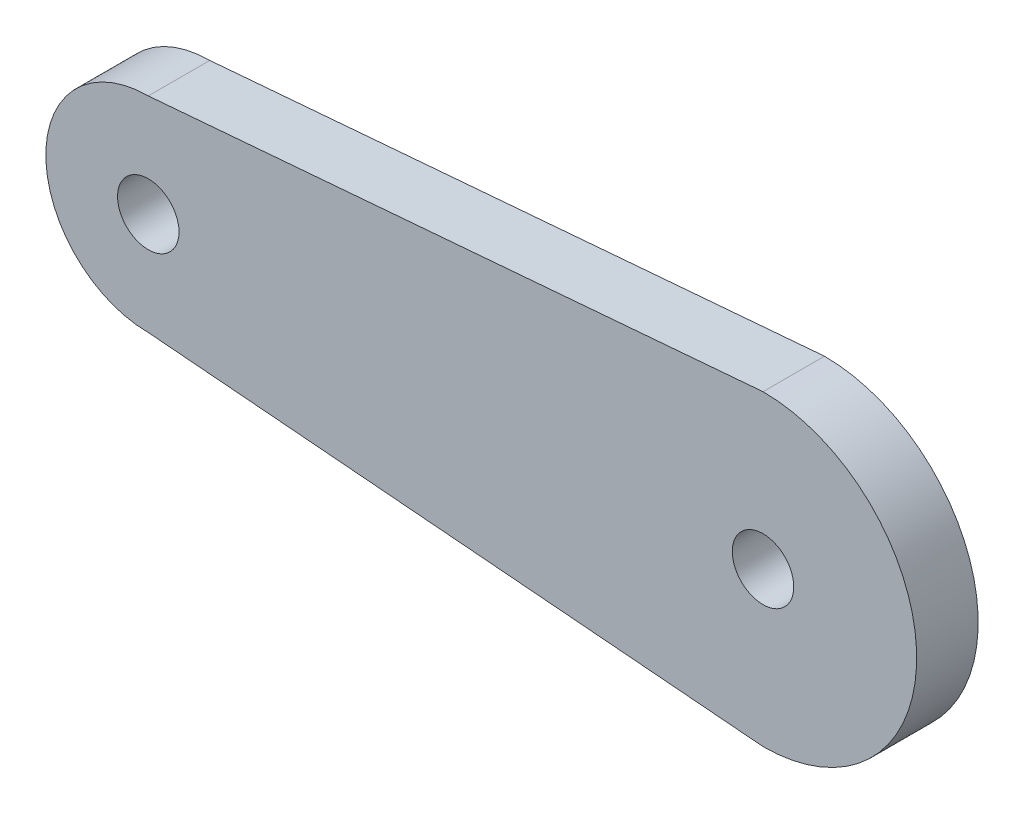
ISO-10303-21;
HEADER;
FILE_DESCRIPTION(('STEP AP214'),'2;1');
FILE_NAME('part.step','',(''),(''),'','','');
FILE_SCHEMA(('AUTOMOTIVE_DESIGN { 1 0 10303 214 1 1 1 1 }'));
ENDSEC;
DATA;
#1=APPLICATION_CONTEXT('core data for automotive mechanical design processes');
#2=APPLICATION_PROTOCOL_DEFINITION('international standard','automotive_design',2000,#1);
#3=PRODUCT_CONTEXT('',#1,'mechanical');
#4=PRODUCT('Part','Part','',(#3));
#5=PRODUCT_RELATED_PRODUCT_CATEGORY('part','',(#4));
#6=PRODUCT_DEFINITION_FORMATION('','',#4);
#7=PRODUCT_DEFINITION_CONTEXT('part definition',#1,'design');
#8=PRODUCT_DEFINITION('design','',#6,#7);
#9=PRODUCT_DEFINITION_SHAPE('','',#8);
#10=(LENGTH_UNIT() NAMED_UNIT(*) SI_UNIT(.MILLI.,.METRE.));
#11=(NAMED_UNIT(*) PLANE_ANGLE_UNIT() SI_UNIT($,.RADIAN.));
#12=(NAMED_UNIT(*) SI_UNIT($,.STERADIAN.) SOLID_ANGLE_UNIT());
#13=UNCERTAINTY_MEASURE_WITH_UNIT(LENGTH_MEASURE(1.E-05),#10,'distance_accuracy_value','');
#14=(GEOMETRIC_REPRESENTATION_CONTEXT(3) GLOBAL_UNCERTAINTY_ASSIGNED_CONTEXT((#13)) GLOBAL_UNIT_ASSIGNED_CONTEXT((#10,
#11,#12)) REPRESENTATION_CONTEXT('',''));
#15=CARTESIAN_POINT('',(0.,0.,0.));
#16=DIRECTION('',(0.,0.,1.));
#17=DIRECTION('',(1.,0.,0.));
#18=AXIS2_PLACEMENT_3D('',#15,#16,#17);
#19=CARTESIAN_POINT('',(30.,0.,3.));
#20=DIRECTION('',(0.,0.,-1.));
#21=DIRECTION('',(-1.,0.,0.));
#22=AXIS2_PLACEMENT_3D('',#19,#20,#21);
#23=CYLINDRICAL_SURFACE('',#22,7.5);
#24=CARTESIAN_POINT('',(30.,0.,0.));
#25=DIRECTION('',(0.,0.,1.));
#26=DIRECTION('',(1.,0.,0.));
#27=AXIS2_PLACEMENT_3D('',#24,#25,#26);
#28=CIRCLE('',#27,7.5);
#29=CARTESIAN_POINT('',(30.,7.50000000000001,0.));
#30=VERTEX_POINT('',#29);
#31=CARTESIAN_POINT('',(30.,-7.49999999999999,0.));
#32=VERTEX_POINT('',#31);
#33=EDGE_CURVE('E109',#30,#32,#28,.F.);
#34=ORIENTED_EDGE('',*,*,#33,.F.);
#35=DIRECTION('',(0.,0.,-1.));
#36=VECTOR('',#35,1.);
#37=CARTESIAN_POINT('',(30.,7.50000000000001,3.));
#38=LINE('',#37,#36);
#39=CARTESIAN_POINT('',(30.,7.50000000000001,3.));
#40=VERTEX_POINT('',#39);
#41=EDGE_CURVE('E11',#40,#30,#38,.T.);
#42=ORIENTED_EDGE('',*,*,#41,.F.);
#43=CARTESIAN_POINT('',(30.,0.,3.));
#44=DIRECTION('',(0.,0.,1.));
#45=DIRECTION('',(1.,0.,0.));
#46=AXIS2_PLACEMENT_3D('',#43,#44,#45);
#47=CIRCLE('',#46,7.5);
#48=CARTESIAN_POINT('',(30.,-7.49999999999999,3.));
#49=VERTEX_POINT('',#48);
#50=EDGE_CURVE('E97',#40,#49,#47,.F.);
#51=ORIENTED_EDGE('',*,*,#50,.T.);
#52=DIRECTION('',(0.,0.,-1.));
#53=VECTOR('',#52,1.);
#54=CARTESIAN_POINT('',(30.,-7.49999999999999,3.));
#55=LINE('',#54,#53);
#56=EDGE_CURVE('E77',#49,#32,#55,.T.);
#57=ORIENTED_EDGE('',*,*,#56,.T.);
#58=EDGE_LOOP('',(#34,#42,#51,#57));
#59=FACE_BOUND('',#58,.T.);
#60=ADVANCED_FACE('F39',(#59),#23,.T.);
#61=CARTESIAN_POINT('',(-0.413793103448277,4.96551724137931,3.));
#62=DIRECTION('',(-0.0830454798537402,0.996545758244879,0.));
#63=DIRECTION('',(-0.99654575824488,-0.0830454798537402,0.));
#64=AXIS2_PLACEMENT_3D('',#61,#62,#63);
#65=PLANE('',#64);
#66=DIRECTION('',(0.99654575824488,0.0830454798537402,0.));
#67=VECTOR('',#66,1.);
#68=CARTESIAN_POINT('',(-0.413793103448277,4.96551724137931,0.));
#69=LINE('',#68,#67);
#70=CARTESIAN_POINT('',(0.,5.,0.));
#71=VERTEX_POINT('',#70);
#72=EDGE_CURVE('E90',#71,#30,#69,.T.);
#73=ORIENTED_EDGE('',*,*,#72,.F.);
#74=DIRECTION('',(0.,0.,-1.));
#75=VECTOR('',#74,1.);
#76=CARTESIAN_POINT('',(0.,5.,3.));
#77=LINE('',#76,#75);
#78=CARTESIAN_POINT('',(0.,5.,3.));
#79=VERTEX_POINT('',#78);
#80=EDGE_CURVE('E47',#79,#71,#77,.T.);
#81=ORIENTED_EDGE('',*,*,#80,.F.);
#82=DIRECTION('',(0.99654575824488,0.0830454798537402,0.));
#83=VECTOR('',#82,1.);
#84=CARTESIAN_POINT('',(-0.413793103448277,4.96551724137931,3.));
#85=LINE('',#84,#83);
#86=EDGE_CURVE('E88',#79,#40,#85,.T.);
#87=ORIENTED_EDGE('',*,*,#86,.T.);
#88=ORIENTED_EDGE('',*,*,#41,.T.);
#89=EDGE_LOOP('',(#73,#81,#87,#88));
#90=FACE_BOUND('',#89,.T.);
#91=ADVANCED_FACE('F86',(#90),#65,.T.);
#92=CARTESIAN_POINT('',(0.,0.,3.));
#93=DIRECTION('',(0.,0.,-1.));
#94=DIRECTION('',(-1.,0.,0.));
#95=AXIS2_PLACEMENT_3D('',#92,#93,#94);
#96=CYLINDRICAL_SURFACE('',#95,5.);
#97=CARTESIAN_POINT('',(0.,0.,0.));
#98=DIRECTION('',(0.,0.,1.));
#99=DIRECTION('',(1.,0.,0.));
#100=AXIS2_PLACEMENT_3D('',#97,#98,#99);
#101=CIRCLE('',#100,5.);
#102=CARTESIAN_POINT('',(0.,-5.,0.));
#103=VERTEX_POINT('',#102);
#104=EDGE_CURVE('E70',#71,#103,#101,.T.);
#105=ORIENTED_EDGE('',*,*,#104,.T.);
#106=DIRECTION('',(0.,0.,-1.));
#107=VECTOR('',#106,1.);
#108=CARTESIAN_POINT('',(0.,-5.,3.));
#109=LINE('',#108,#107);
#110=CARTESIAN_POINT('',(0.,-5.,3.));
#111=VERTEX_POINT('',#110);
#112=EDGE_CURVE('E91',#111,#103,#109,.T.);
#113=ORIENTED_EDGE('',*,*,#112,.F.);
#114=CARTESIAN_POINT('',(0.,0.,3.));
#115=DIRECTION('',(0.,0.,1.));
#116=DIRECTION('',(1.,0.,0.));
#117=AXIS2_PLACEMENT_3D('',#114,#115,#116);
#118=CIRCLE('',#117,5.);
#119=EDGE_CURVE('E92',#79,#111,#118,.T.);
#120=ORIENTED_EDGE('',*,*,#119,.F.);
#121=ORIENTED_EDGE('',*,*,#80,.T.);
#122=EDGE_LOOP('',(#105,#113,#120,#121));
#123=FACE_BOUND('',#122,.T.);
#124=ADVANCED_FACE('F93',(#123),#96,.T.);
#125=CARTESIAN_POINT('',(30.,0.,3.));
#126=DIRECTION('',(0.,0.,-1.));
#127=DIRECTION('',(-1.,0.,0.));
#128=AXIS2_PLACEMENT_3D('',#125,#126,#127);
#129=CYLINDRICAL_SURFACE('',#128,1.5);
#130=CARTESIAN_POINT('',(30.,0.,3.));
#131=DIRECTION('',(0.,0.,1.));
#132=DIRECTION('',(1.,0.,0.));
#133=AXIS2_PLACEMENT_3D('',#130,#131,#132);
#134=CIRCLE('',#133,1.5);
#135=CARTESIAN_POINT('',(31.5,0.,3.));
#136=VERTEX_POINT('',#135);
#137=EDGE_CURVE('E103',#136,#136,#134,.T.);
#138=ORIENTED_EDGE('',*,*,#137,.T.);
#139=EDGE_LOOP('',(#138));
#140=FACE_BOUND('',#139,.T.);
#141=CARTESIAN_POINT('',(30.,0.,0.));
#142=DIRECTION('',(0.,0.,1.));
#143=DIRECTION('',(1.,0.,0.));
#144=AXIS2_PLACEMENT_3D('',#141,#142,#143);
#145=CIRCLE('',#144,1.5);
#146=CARTESIAN_POINT('',(31.5,0.,0.));
#147=VERTEX_POINT('',#146);
#148=EDGE_CURVE('E116',#147,#147,#145,.T.);
#149=ORIENTED_EDGE('',*,*,#148,.F.);
#150=EDGE_LOOP('',(#149));
#151=FACE_BOUND('',#150,.T.);
#152=ADVANCED_FACE('F135',(#140,#151),#129,.F.);
#153=CARTESIAN_POINT('',(-0.413793103448274,-4.96551724137931,3.));
#154=DIRECTION('',(0.0830454798537395,0.99654575824488,0.));
#155=DIRECTION('',(-0.99654575824488,0.0830454798537396,0.));
#156=AXIS2_PLACEMENT_3D('',#153,#154,#155);
#157=PLANE('',#156);
#158=DIRECTION('',(0.99654575824488,-0.0830454798537396,0.));
#159=VECTOR('',#158,1.);
#160=CARTESIAN_POINT('',(-0.413793103448274,-4.96551724137931,0.));
#161=LINE('',#160,#159);
#162=EDGE_CURVE('E114',#103,#32,#161,.T.);
#163=ORIENTED_EDGE('',*,*,#162,.T.);
#164=ORIENTED_EDGE('',*,*,#56,.F.);
#165=DIRECTION('',(0.99654575824488,-0.0830454798537396,0.));
#166=VECTOR('',#165,1.);
#167=CARTESIAN_POINT('',(-0.413793103448274,-4.96551724137931,3.));
#168=LINE('',#167,#166);
#169=EDGE_CURVE('E55',#111,#49,#168,.T.);
#170=ORIENTED_EDGE('',*,*,#169,.F.);
#171=ORIENTED_EDGE('',*,*,#112,.T.);
#172=EDGE_LOOP('',(#163,#164,#170,#171));
#173=FACE_BOUND('',#172,.T.);
#174=ADVANCED_FACE('F124',(#173),#157,.F.);
#175=CARTESIAN_POINT('',(0.,0.,3.));
#176=DIRECTION('',(0.,0.,-1.));
#177=DIRECTION('',(-1.,0.,0.));
#178=AXIS2_PLACEMENT_3D('',#175,#176,#177);
#179=CYLINDRICAL_SURFACE('',#178,1.5);
#180=CARTESIAN_POINT('',(0.,0.,3.));
#181=DIRECTION('',(0.,0.,1.));
#182=DIRECTION('',(1.,0.,0.));
#183=AXIS2_PLACEMENT_3D('',#180,#181,#182);
#184=CIRCLE('',#183,1.5);
#185=CARTESIAN_POINT('',(1.5,0.,3.));
#186=VERTEX_POINT('',#185);
#187=EDGE_CURVE('E106',#186,#186,#184,.T.);
#188=ORIENTED_EDGE('',*,*,#187,.T.);
#189=EDGE_LOOP('',(#188));
#190=FACE_BOUND('',#189,.T.);
#191=CARTESIAN_POINT('',(0.,0.,0.));
#192=DIRECTION('',(0.,0.,1.));
#193=DIRECTION('',(1.,0.,0.));
#194=AXIS2_PLACEMENT_3D('',#191,#192,#193);
#195=CIRCLE('',#194,1.5);
#196=CARTESIAN_POINT('',(1.5,0.,0.));
#197=VERTEX_POINT('',#196);
#198=EDGE_CURVE('E99',#197,#197,#195,.T.);
#199=ORIENTED_EDGE('',*,*,#198,.F.);
#200=EDGE_LOOP('',(#199));
#201=FACE_BOUND('',#200,.T.);
#202=ADVANCED_FACE('F140',(#190,#201),#179,.F.);
#203=CARTESIAN_POINT('',(0.,0.,3.));
#204=DIRECTION('',(0.,0.,1.));
#205=DIRECTION('',(1.,0.,0.));
#206=AXIS2_PLACEMENT_3D('',#203,#204,#205);
#207=PLANE('',#206);
#208=ORIENTED_EDGE('',*,*,#50,.F.);
#209=ORIENTED_EDGE('',*,*,#86,.F.);
#210=ORIENTED_EDGE('',*,*,#119,.T.);
#211=ORIENTED_EDGE('',*,*,#169,.T.);
#212=EDGE_LOOP('',(#208,#209,#210,#211));
#213=FACE_BOUND('',#212,.T.);
#214=ORIENTED_EDGE('',*,*,#137,.F.);
#215=EDGE_LOOP('',(#214));
#216=FACE_BOUND('',#215,.T.);
#217=ORIENTED_EDGE('',*,*,#187,.F.);
#218=EDGE_LOOP('',(#217));
#219=FACE_BOUND('',#218,.T.);
#220=ADVANCED_FACE('F95',(#213,#216,#219),#207,.T.);
#221=CARTESIAN_POINT('',(0.,0.,0.));
#222=DIRECTION('',(0.,0.,1.));
#223=DIRECTION('',(1.,0.,0.));
#224=AXIS2_PLACEMENT_3D('',#221,#222,#223);
#225=PLANE('',#224);
#226=ORIENTED_EDGE('',*,*,#33,.T.);
#227=ORIENTED_EDGE('',*,*,#162,.F.);
#228=ORIENTED_EDGE('',*,*,#104,.F.);
#229=ORIENTED_EDGE('',*,*,#72,.T.);
#230=EDGE_LOOP('',(#226,#227,#228,#229));
#231=FACE_BOUND('',#230,.T.);
#232=ORIENTED_EDGE('',*,*,#148,.T.);
#233=EDGE_LOOP('',(#232));
#234=FACE_BOUND('',#233,.T.);
#235=ORIENTED_EDGE('',*,*,#198,.T.);
#236=EDGE_LOOP('',(#235));
#237=FACE_BOUND('',#236,.T.);
#238=ADVANCED_FACE('F126',(#231,#234,#237),#225,.F.);
#239=CLOSED_SHELL('',(#60,#91,#124,#152,#174,#202,#220,#238));
#240=MANIFOLD_SOLID_BREP('B2',#239);
#241=ADVANCED_BREP_SHAPE_REPRESENTATION('',(#18,#240),#14);
#242=SHAPE_DEFINITION_REPRESENTATION(#9,#241);
ENDSEC;
END-ISO-10303-21;
